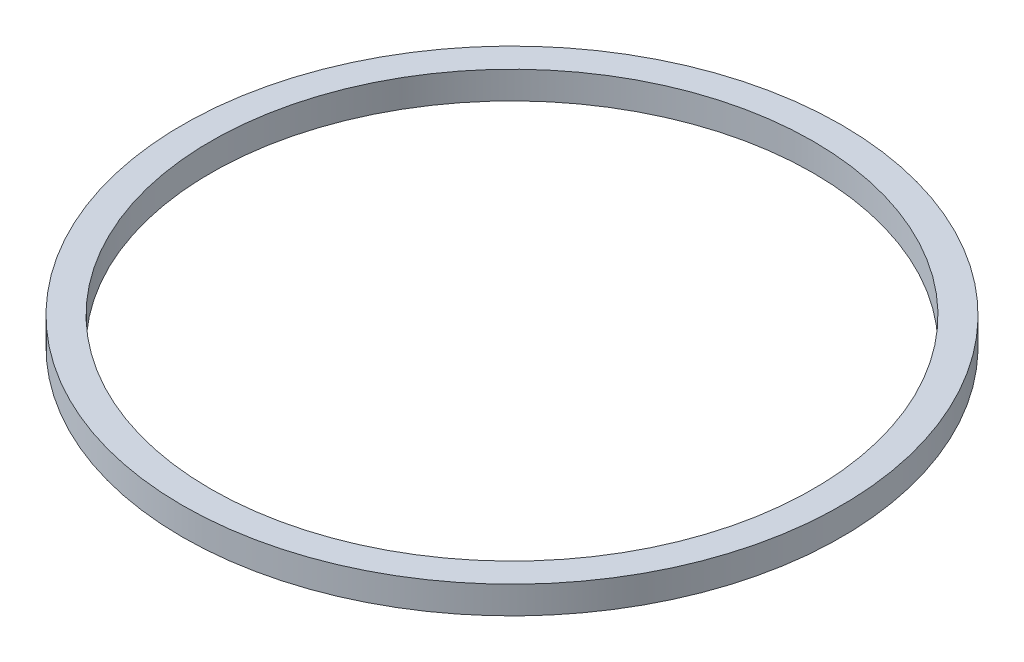
ISO-10303-21;
HEADER;
FILE_DESCRIPTION(('STEP AP214'),'2;1');
FILE_NAME('part.step','',(''),(''),'','','');
FILE_SCHEMA(('AUTOMOTIVE_DESIGN { 1 0 10303 214 1 1 1 1 }'));
ENDSEC;
DATA;
#1=APPLICATION_CONTEXT('core data for automotive mechanical design processes');
#2=APPLICATION_PROTOCOL_DEFINITION('international standard','automotive_design',2000,#1);
#3=PRODUCT_CONTEXT('',#1,'mechanical');
#4=PRODUCT('Part','Part','',(#3));
#5=PRODUCT_RELATED_PRODUCT_CATEGORY('part','',(#4));
#6=PRODUCT_DEFINITION_FORMATION('','',#4);
#7=PRODUCT_DEFINITION_CONTEXT('part definition',#1,'design');
#8=PRODUCT_DEFINITION('design','',#6,#7);
#9=PRODUCT_DEFINITION_SHAPE('','',#8);
#10=(LENGTH_UNIT() NAMED_UNIT(*) SI_UNIT(.MILLI.,.METRE.));
#11=(NAMED_UNIT(*) PLANE_ANGLE_UNIT() SI_UNIT($,.RADIAN.));
#12=(NAMED_UNIT(*) SI_UNIT($,.STERADIAN.) SOLID_ANGLE_UNIT());
#13=UNCERTAINTY_MEASURE_WITH_UNIT(LENGTH_MEASURE(1.E-05),#10,'distance_accuracy_value','');
#14=(GEOMETRIC_REPRESENTATION_CONTEXT(3) GLOBAL_UNCERTAINTY_ASSIGNED_CONTEXT((#13)) GLOBAL_UNIT_ASSIGNED_CONTEXT((#10,
#11,#12)) REPRESENTATION_CONTEXT('',''));
#15=CARTESIAN_POINT('',(0.,0.,0.));
#16=DIRECTION('',(0.,0.,1.));
#17=DIRECTION('',(1.,0.,0.));
#18=AXIS2_PLACEMENT_3D('',#15,#16,#17);
#19=CARTESIAN_POINT('',(0.,1.,0.));
#20=DIRECTION('',(0.,1.,0.));
#21=DIRECTION('',(0.,0.,1.));
#22=AXIS2_PLACEMENT_3D('',#19,#20,#21);
#23=PLANE('',#22);
#24=CARTESIAN_POINT('',(0.,1.,0.));
#25=DIRECTION('',(0.,1.,0.));
#26=DIRECTION('',(0.,0.,1.));
#27=AXIS2_PLACEMENT_3D('',#24,#25,#26);
#28=CIRCLE('',#27,12.);
#29=CARTESIAN_POINT('',(0.,1.,12.));
#30=VERTEX_POINT('',#29);
#31=EDGE_CURVE('E10',#30,#30,#28,.T.);
#32=ORIENTED_EDGE('',*,*,#31,.T.);
#33=EDGE_LOOP('',(#32));
#34=FACE_BOUND('',#33,.T.);
#35=CARTESIAN_POINT('',(0.,1.,0.));
#36=DIRECTION('',(0.,1.,0.));
#37=DIRECTION('',(0.,0.,1.));
#38=AXIS2_PLACEMENT_3D('',#35,#36,#37);
#39=CIRCLE('',#38,10.968);
#40=CARTESIAN_POINT('',(0.,1.,10.968));
#41=VERTEX_POINT('',#40);
#42=EDGE_CURVE('E46',#41,#41,#39,.T.);
#43=ORIENTED_EDGE('',*,*,#42,.F.);
#44=EDGE_LOOP('',(#43));
#45=FACE_BOUND('',#44,.T.);
#46=ADVANCED_FACE('F35',(#34,#45),#23,.T.);
#47=CARTESIAN_POINT('',(0.,0.,0.));
#48=DIRECTION('',(0.,1.,0.));
#49=DIRECTION('',(0.,0.,1.));
#50=AXIS2_PLACEMENT_3D('',#47,#48,#49);
#51=PLANE('',#50);
#52=CARTESIAN_POINT('',(0.,0.,0.));
#53=DIRECTION('',(0.,1.,0.));
#54=DIRECTION('',(0.,0.,1.));
#55=AXIS2_PLACEMENT_3D('',#52,#53,#54);
#56=CIRCLE('',#55,12.);
#57=CARTESIAN_POINT('',(0.,0.,12.));
#58=VERTEX_POINT('',#57);
#59=EDGE_CURVE('E39',#58,#58,#56,.T.);
#60=ORIENTED_EDGE('',*,*,#59,.F.);
#61=EDGE_LOOP('',(#60));
#62=FACE_BOUND('',#61,.T.);
#63=CARTESIAN_POINT('',(0.,0.,0.));
#64=DIRECTION('',(0.,1.,0.));
#65=DIRECTION('',(0.,0.,1.));
#66=AXIS2_PLACEMENT_3D('',#63,#64,#65);
#67=CIRCLE('',#66,10.968);
#68=CARTESIAN_POINT('',(0.,0.,10.968));
#69=VERTEX_POINT('',#68);
#70=EDGE_CURVE('E48',#69,#69,#67,.T.);
#71=ORIENTED_EDGE('',*,*,#70,.T.);
#72=EDGE_LOOP('',(#71));
#73=FACE_BOUND('',#72,.T.);
#74=ADVANCED_FACE('F58',(#62,#73),#51,.F.);
#75=CARTESIAN_POINT('',(0.,1.,0.));
#76=DIRECTION('',(0.,-1.,0.));
#77=DIRECTION('',(0.,0.,-1.));
#78=AXIS2_PLACEMENT_3D('',#75,#76,#77);
#79=CYLINDRICAL_SURFACE('',#78,12.);
#80=ORIENTED_EDGE('',*,*,#31,.F.);
#81=EDGE_LOOP('',(#80));
#82=FACE_BOUND('',#81,.T.);
#83=ORIENTED_EDGE('',*,*,#59,.T.);
#84=EDGE_LOOP('',(#83));
#85=FACE_BOUND('',#84,.T.);
#86=ADVANCED_FACE('F37',(#82,#85),#79,.T.);
#87=CARTESIAN_POINT('',(0.,1.,0.));
#88=DIRECTION('',(0.,-1.,0.));
#89=DIRECTION('',(0.,0.,-1.));
#90=AXIS2_PLACEMENT_3D('',#87,#88,#89);
#91=CYLINDRICAL_SURFACE('',#90,10.968);
#92=ORIENTED_EDGE('',*,*,#42,.T.);
#93=EDGE_LOOP('',(#92));
#94=FACE_BOUND('',#93,.T.);
#95=ORIENTED_EDGE('',*,*,#70,.F.);
#96=EDGE_LOOP('',(#95));
#97=FACE_BOUND('',#96,.T.);
#98=ADVANCED_FACE('F54',(#94,#97),#91,.F.);
#99=CLOSED_SHELL('',(#46,#74,#86,#98));
#100=MANIFOLD_SOLID_BREP('B2',#99);
#101=ADVANCED_BREP_SHAPE_REPRESENTATION('',(#18,#100),#14);
#102=SHAPE_DEFINITION_REPRESENTATION(#9,#101);
ENDSEC;
END-ISO-10303-21;
